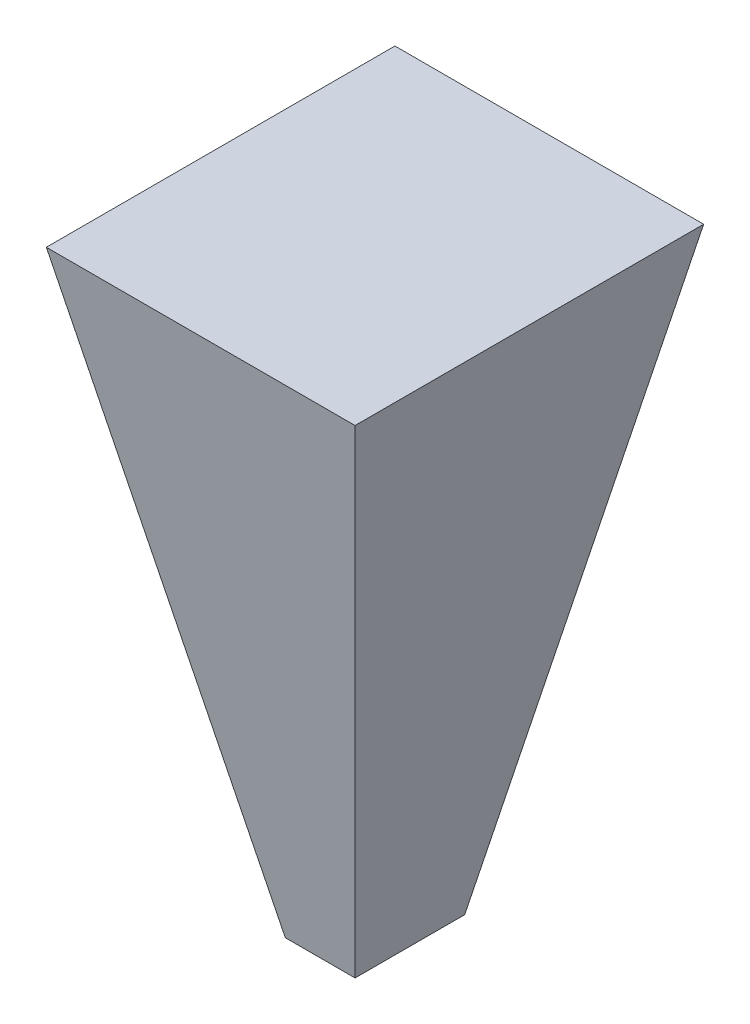
ISO-10303-21;
HEADER;
FILE_DESCRIPTION(('STEP AP214'),'2;1');
FILE_NAME('part.step','',(''),(''),'','','');
FILE_SCHEMA(('AUTOMOTIVE_DESIGN { 1 0 10303 214 1 1 1 1 }'));
ENDSEC;
DATA;
#1=APPLICATION_CONTEXT('core data for automotive mechanical design processes');
#2=APPLICATION_PROTOCOL_DEFINITION('international standard','automotive_design',2000,#1);
#3=PRODUCT_CONTEXT('',#1,'mechanical');
#4=PRODUCT('Part','Part','',(#3));
#5=PRODUCT_RELATED_PRODUCT_CATEGORY('part','',(#4));
#6=PRODUCT_DEFINITION_FORMATION('','',#4);
#7=PRODUCT_DEFINITION_CONTEXT('part definition',#1,'design');
#8=PRODUCT_DEFINITION('design','',#6,#7);
#9=PRODUCT_DEFINITION_SHAPE('','',#8);
#10=(LENGTH_UNIT() NAMED_UNIT(*) SI_UNIT(.MILLI.,.METRE.));
#11=(NAMED_UNIT(*) PLANE_ANGLE_UNIT() SI_UNIT($,.RADIAN.));
#12=(NAMED_UNIT(*) SI_UNIT($,.STERADIAN.) SOLID_ANGLE_UNIT());
#13=UNCERTAINTY_MEASURE_WITH_UNIT(LENGTH_MEASURE(1.E-05),#10,'distance_accuracy_value','');
#14=(GEOMETRIC_REPRESENTATION_CONTEXT(3) GLOBAL_UNCERTAINTY_ASSIGNED_CONTEXT((#13)) GLOBAL_UNIT_ASSIGNED_CONTEXT((#10,
#11,#12)) REPRESENTATION_CONTEXT('',''));
#15=CARTESIAN_POINT('',(0.,0.,0.));
#16=DIRECTION('',(0.,0.,1.));
#17=DIRECTION('',(1.,0.,0.));
#18=AXIS2_PLACEMENT_3D('',#15,#16,#17);
#19=CARTESIAN_POINT('',(3.5,0.,-5.5));
#20=DIRECTION('',(0.980614658546613,-0.195946144242518,0.));
#21=DIRECTION('',(0.195946144242518,0.980614658546613,0.));
#22=AXIS2_PLACEMENT_3D('',#19,#20,#21);
#23=PLANE('',#22);
#24=DIRECTION('',(0.,0.,-1.));
#25=VECTOR('',#24,1.);
#26=CARTESIAN_POINT('',(3.5,0.,-5.5));
#27=LINE('',#26,#25);
#28=CARTESIAN_POINT('',(3.5,0.,5.5));
#29=VERTEX_POINT('',#28);
#30=CARTESIAN_POINT('',(3.5,0.,-5.5));
#31=VERTEX_POINT('',#30);
#32=EDGE_CURVE('E86',#29,#31,#27,.T.);
#33=ORIENTED_EDGE('',*,*,#32,.T.);
#34=DIRECTION('',(-0.192289447048038,-0.962314676760112,0.192289447048038));
#35=VECTOR('',#34,1.);
#36=CARTESIAN_POINT('',(3.24117337987772,-1.2953006995629,-5.24117337987772));
#37=LINE('',#36,#35);
#38=CARTESIAN_POINT('',(15.4891830619542,60.,-17.4891830619542));
#39=VERTEX_POINT('',#38);
#40=EDGE_CURVE('E11',#39,#31,#37,.T.);
#41=ORIENTED_EDGE('',*,*,#40,.F.);
#42=DIRECTION('',(0.,0.,1.));
#43=VECTOR('',#42,1.);
#44=CARTESIAN_POINT('',(15.4891830619542,60.,-5.5));
#45=LINE('',#44,#43);
#46=CARTESIAN_POINT('',(15.4891830619542,60.,17.4891830619542));
#47=VERTEX_POINT('',#46);
#48=EDGE_CURVE('E106',#47,#39,#45,.F.);
#49=ORIENTED_EDGE('',*,*,#48,.F.);
#50=DIRECTION('',(-0.192289447048038,-0.962314676760112,-0.192289447048038));
#51=VECTOR('',#50,1.);
#52=CARTESIAN_POINT('',(3.09327245409356,-2.03547252788455,5.09327245409356));
#53=LINE('',#52,#51);
#54=EDGE_CURVE('E98',#47,#29,#53,.T.);
#55=ORIENTED_EDGE('',*,*,#54,.T.);
#56=EDGE_LOOP('',(#33,#41,#49,#55));
#57=FACE_BOUND('',#56,.T.);
#58=ADVANCED_FACE('F39',(#57),#23,.T.);
#59=CARTESIAN_POINT('',(-3.5,0.,-5.5));
#60=DIRECTION('',(0.,-0.195946144242518,-0.980614658546613));
#61=DIRECTION('',(0.,0.980614658546613,-0.195946144242518));
#62=AXIS2_PLACEMENT_3D('',#59,#60,#61);
#63=PLANE('',#62);
#64=DIRECTION('',(-1.,0.,0.));
#65=VECTOR('',#64,1.);
#66=CARTESIAN_POINT('',(-3.5,0.,-5.5));
#67=LINE('',#66,#65);
#68=CARTESIAN_POINT('',(-3.5,0.,-5.5));
#69=VERTEX_POINT('',#68);
#70=EDGE_CURVE('E82',#31,#69,#67,.T.);
#71=ORIENTED_EDGE('',*,*,#70,.T.);
#72=DIRECTION('',(0.192289447048038,-0.962314676760112,0.192289447048038));
#73=VECTOR('',#72,1.);
#74=CARTESIAN_POINT('',(-3.5,0.,-5.5));
#75=LINE('',#74,#73);
#76=CARTESIAN_POINT('',(-15.4891830619542,60.,-17.4891830619542));
#77=VERTEX_POINT('',#76);
#78=EDGE_CURVE('E49',#77,#69,#75,.T.);
#79=ORIENTED_EDGE('',*,*,#78,.F.);
#80=DIRECTION('',(1.,0.,0.));
#81=VECTOR('',#80,1.);
#82=CARTESIAN_POINT('',(-3.5,60.,-17.4891830619542));
#83=LINE('',#82,#81);
#84=EDGE_CURVE('E94',#39,#77,#83,.F.);
#85=ORIENTED_EDGE('',*,*,#84,.F.);
#86=ORIENTED_EDGE('',*,*,#40,.T.);
#87=EDGE_LOOP('',(#71,#79,#85,#86));
#88=FACE_BOUND('',#87,.T.);
#89=ADVANCED_FACE('F41',(#88),#63,.T.);
#90=CARTESIAN_POINT('',(-3.5,0.,-5.5));
#91=DIRECTION('',(-0.980614658546613,-0.195946144242518,0.));
#92=DIRECTION('',(0.195946144242518,-0.980614658546613,0.));
#93=AXIS2_PLACEMENT_3D('',#90,#91,#92);
#94=PLANE('',#93);
#95=DIRECTION('',(0.,0.,1.));
#96=VECTOR('',#95,1.);
#97=CARTESIAN_POINT('',(-3.5,0.,-5.5));
#98=LINE('',#97,#96);
#99=CARTESIAN_POINT('',(-3.5,0.,5.5));
#100=VERTEX_POINT('',#99);
#101=EDGE_CURVE('E87',#69,#100,#98,.T.);
#102=ORIENTED_EDGE('',*,*,#101,.T.);
#103=DIRECTION('',(0.192289447048038,-0.962314676760112,-0.192289447048038));
#104=VECTOR('',#103,1.);
#105=CARTESIAN_POINT('',(-3.5,0.,5.5));
#106=LINE('',#105,#104);
#107=CARTESIAN_POINT('',(-15.4891830619542,60.,17.4891830619542));
#108=VERTEX_POINT('',#107);
#109=EDGE_CURVE('E110',#108,#100,#106,.T.);
#110=ORIENTED_EDGE('',*,*,#109,.F.);
#111=DIRECTION('',(0.,0.,-1.));
#112=VECTOR('',#111,1.);
#113=CARTESIAN_POINT('',(-15.4891830619542,60.,-5.5));
#114=LINE('',#113,#112);
#115=EDGE_CURVE('E61',#77,#108,#114,.F.);
#116=ORIENTED_EDGE('',*,*,#115,.F.);
#117=ORIENTED_EDGE('',*,*,#78,.T.);
#118=EDGE_LOOP('',(#102,#110,#116,#117));
#119=FACE_BOUND('',#118,.T.);
#120=ADVANCED_FACE('F123',(#119),#94,.T.);
#121=CARTESIAN_POINT('',(-3.5,0.,5.5));
#122=DIRECTION('',(0.,-0.195946144242518,0.980614658546613));
#123=DIRECTION('',(0.,-0.980614658546613,-0.195946144242518));
#124=AXIS2_PLACEMENT_3D('',#121,#122,#123);
#125=PLANE('',#124);
#126=DIRECTION('',(1.,0.,0.));
#127=VECTOR('',#126,1.);
#128=CARTESIAN_POINT('',(-3.5,0.,5.5));
#129=LINE('',#128,#127);
#130=EDGE_CURVE('E104',#100,#29,#129,.T.);
#131=ORIENTED_EDGE('',*,*,#130,.T.);
#132=ORIENTED_EDGE('',*,*,#54,.F.);
#133=DIRECTION('',(-1.,0.,0.));
#134=VECTOR('',#133,1.);
#135=CARTESIAN_POINT('',(-3.5,60.,17.4891830619542));
#136=LINE('',#135,#134);
#137=EDGE_CURVE('E43',#108,#47,#136,.F.);
#138=ORIENTED_EDGE('',*,*,#137,.F.);
#139=ORIENTED_EDGE('',*,*,#109,.T.);
#140=EDGE_LOOP('',(#131,#132,#138,#139));
#141=FACE_BOUND('',#140,.T.);
#142=ADVANCED_FACE('F125',(#141),#125,.T.);
#143=CARTESIAN_POINT('',(0.,60.,0.));
#144=DIRECTION('',(0.,1.,0.));
#145=DIRECTION('',(0.,0.,1.));
#146=AXIS2_PLACEMENT_3D('',#143,#144,#145);
#147=PLANE('',#146);
#148=ORIENTED_EDGE('',*,*,#48,.T.);
#149=ORIENTED_EDGE('',*,*,#84,.T.);
#150=ORIENTED_EDGE('',*,*,#115,.T.);
#151=ORIENTED_EDGE('',*,*,#137,.T.);
#152=EDGE_LOOP('',(#148,#149,#150,#151));
#153=FACE_BOUND('',#152,.T.);
#154=ADVANCED_FACE('F121',(#153),#147,.T.);
#155=CARTESIAN_POINT('',(0.,0.,0.));
#156=DIRECTION('',(0.,1.,0.));
#157=DIRECTION('',(0.,0.,1.));
#158=AXIS2_PLACEMENT_3D('',#155,#156,#157);
#159=PLANE('',#158);
#160=ORIENTED_EDGE('',*,*,#32,.F.);
#161=ORIENTED_EDGE('',*,*,#130,.F.);
#162=ORIENTED_EDGE('',*,*,#101,.F.);
#163=ORIENTED_EDGE('',*,*,#70,.F.);
#164=EDGE_LOOP('',(#160,#161,#162,#163));
#165=FACE_BOUND('',#164,.T.);
#166=ADVANCED_FACE('F83',(#165),#159,.F.);
#167=CLOSED_SHELL('',(#58,#89,#120,#142,#154,#166));
#168=MANIFOLD_SOLID_BREP('B2',#167);
#169=ADVANCED_BREP_SHAPE_REPRESENTATION('',(#18,#168),#14);
#170=SHAPE_DEFINITION_REPRESENTATION(#9,#169);
ENDSEC;
END-ISO-10303-21;
